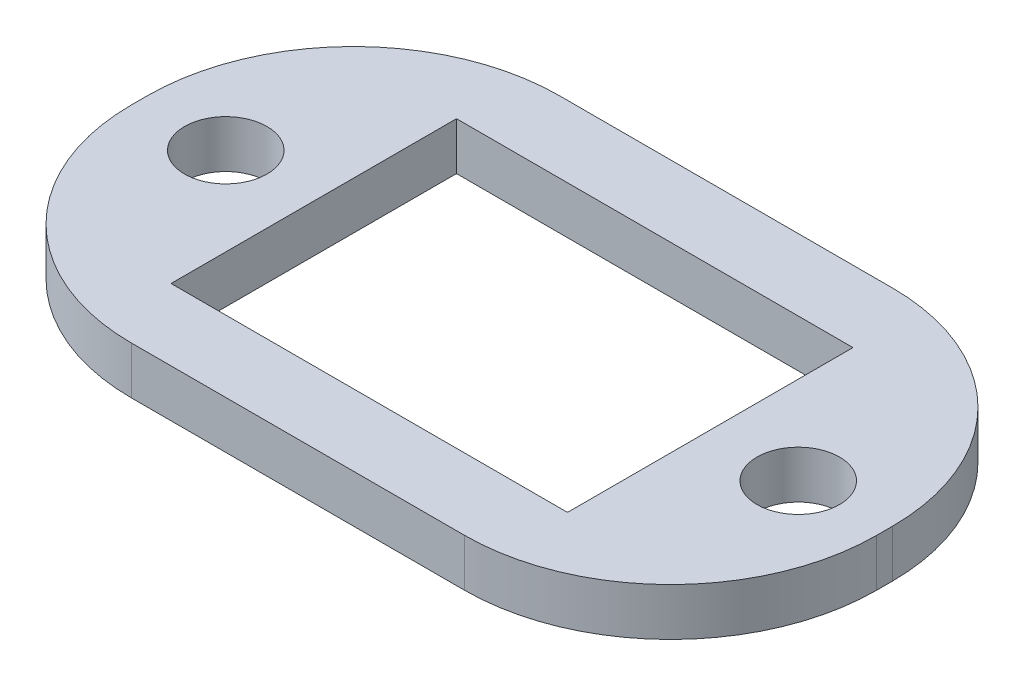
ISO-10303-21;
HEADER;
FILE_DESCRIPTION(('STEP AP214'),'2;1');
FILE_NAME('part.step','',(''),(''),'','','');
FILE_SCHEMA(('AUTOMOTIVE_DESIGN { 1 0 10303 214 1 1 1 1 }'));
ENDSEC;
DATA;
#1=APPLICATION_CONTEXT('core data for automotive mechanical design processes');
#2=APPLICATION_PROTOCOL_DEFINITION('international standard','automotive_design',2000,#1);
#3=PRODUCT_CONTEXT('',#1,'mechanical');
#4=PRODUCT('Part','Part','',(#3));
#5=PRODUCT_RELATED_PRODUCT_CATEGORY('part','',(#4));
#6=PRODUCT_DEFINITION_FORMATION('','',#4);
#7=PRODUCT_DEFINITION_CONTEXT('part definition',#1,'design');
#8=PRODUCT_DEFINITION('design','',#6,#7);
#9=PRODUCT_DEFINITION_SHAPE('','',#8);
#10=(LENGTH_UNIT() NAMED_UNIT(*) SI_UNIT(.MILLI.,.METRE.));
#11=(NAMED_UNIT(*) PLANE_ANGLE_UNIT() SI_UNIT($,.RADIAN.));
#12=(NAMED_UNIT(*) SI_UNIT($,.STERADIAN.) SOLID_ANGLE_UNIT());
#13=UNCERTAINTY_MEASURE_WITH_UNIT(LENGTH_MEASURE(1.E-05),#10,'distance_accuracy_value','');
#14=(GEOMETRIC_REPRESENTATION_CONTEXT(3) GLOBAL_UNCERTAINTY_ASSIGNED_CONTEXT((#13)) GLOBAL_UNIT_ASSIGNED_CONTEXT((#10,
#11,#12)) REPRESENTATION_CONTEXT('',''));
#15=CARTESIAN_POINT('',(0.,0.,0.));
#16=DIRECTION('',(0.,0.,1.));
#17=DIRECTION('',(1.,0.,0.));
#18=AXIS2_PLACEMENT_3D('',#15,#16,#17);
#19=CARTESIAN_POINT('',(10.5,3.,-0.5));
#20=DIRECTION('',(0.,-1.,0.));
#21=DIRECTION('',(0.,0.,-1.));
#22=AXIS2_PLACEMENT_3D('',#19,#20,#21);
#23=PLANE('',#22);
#24=CARTESIAN_POINT('',(-18.05,3.,0.));
#25=DIRECTION('',(0.,1.,0.));
#26=DIRECTION('',(0.,0.,-1.));
#27=AXIS2_PLACEMENT_3D('',#24,#25,#26);
#28=CIRCLE('',#27,2.60000000000001);
#29=CARTESIAN_POINT('',(-18.05,3.,-2.6));
#30=VERTEX_POINT('',#29);
#31=EDGE_CURVE('E177',#30,#30,#28,.T.);
#32=ORIENTED_EDGE('',*,*,#31,.F.);
#33=EDGE_LOOP('',(#32));
#34=FACE_BOUND('',#33,.T.);
#35=CARTESIAN_POINT('',(18.05,3.,0.));
#36=DIRECTION('',(0.,1.,0.));
#37=DIRECTION('',(0.,0.,1.));
#38=AXIS2_PLACEMENT_3D('',#35,#36,#37);
#39=CIRCLE('',#38,2.6);
#40=CARTESIAN_POINT('',(18.05,3.,2.6));
#41=VERTEX_POINT('',#40);
#42=EDGE_CURVE('E185',#41,#41,#39,.T.);
#43=ORIENTED_EDGE('',*,*,#42,.F.);
#44=EDGE_LOOP('',(#43));
#45=FACE_BOUND('',#44,.T.);
#46=CARTESIAN_POINT('',(10.5,3.,-0.5));
#47=DIRECTION('',(0.,1.,0.));
#48=DIRECTION('',(0.,0.,-1.));
#49=AXIS2_PLACEMENT_3D('',#46,#47,#48);
#50=CIRCLE('',#49,13.);
#51=CARTESIAN_POINT('',(23.5,3.,-0.49999999999991));
#52=VERTEX_POINT('',#51);
#53=CARTESIAN_POINT('',(10.4999999999999,3.,-13.5));
#54=VERTEX_POINT('',#53);
#55=EDGE_CURVE('E193',#52,#54,#50,.T.);
#56=ORIENTED_EDGE('',*,*,#55,.T.);
#57=DIRECTION('',(-1.,0.,0.));
#58=VECTOR('',#57,1.);
#59=CARTESIAN_POINT('',(-10.4999999999999,3.,-13.5));
#60=LINE('',#59,#58);
#61=CARTESIAN_POINT('',(-10.4999999999999,3.,-13.5));
#62=VERTEX_POINT('',#61);
#63=EDGE_CURVE('E197',#54,#62,#60,.T.);
#64=ORIENTED_EDGE('',*,*,#63,.T.);
#65=CARTESIAN_POINT('',(-10.5,3.,-0.500000000000002));
#66=DIRECTION('',(0.,1.,0.));
#67=DIRECTION('',(0.,0.,1.));
#68=AXIS2_PLACEMENT_3D('',#65,#66,#67);
#69=CIRCLE('',#68,13.);
#70=CARTESIAN_POINT('',(-23.5,3.,-0.499999999999912));
#71=VERTEX_POINT('',#70);
#72=EDGE_CURVE('E201',#62,#71,#69,.T.);
#73=ORIENTED_EDGE('',*,*,#72,.T.);
#74=DIRECTION('',(0.,0.,1.));
#75=VECTOR('',#74,1.);
#76=CARTESIAN_POINT('',(-23.5,3.,-0.499999999999909));
#77=LINE('',#76,#75);
#78=CARTESIAN_POINT('',(-23.5,3.,0.499999999999909));
#79=VERTEX_POINT('',#78);
#80=EDGE_CURVE('E204',#71,#79,#77,.T.);
#81=ORIENTED_EDGE('',*,*,#80,.T.);
#82=CARTESIAN_POINT('',(-10.5,3.,0.5));
#83=DIRECTION('',(0.,1.,0.));
#84=DIRECTION('',(0.,0.,1.));
#85=AXIS2_PLACEMENT_3D('',#82,#83,#84);
#86=CIRCLE('',#85,13.);
#87=CARTESIAN_POINT('',(-10.5,3.,13.5));
#88=VERTEX_POINT('',#87);
#89=EDGE_CURVE('E207',#79,#88,#86,.T.);
#90=ORIENTED_EDGE('',*,*,#89,.T.);
#91=DIRECTION('',(1.,0.,0.));
#92=VECTOR('',#91,1.);
#93=CARTESIAN_POINT('',(-10.4999999999999,3.,13.5));
#94=LINE('',#93,#92);
#95=CARTESIAN_POINT('',(10.4999999999999,3.,13.5));
#96=VERTEX_POINT('',#95);
#97=EDGE_CURVE('E210',#88,#96,#94,.T.);
#98=ORIENTED_EDGE('',*,*,#97,.T.);
#99=CARTESIAN_POINT('',(10.5,3.,0.500000000000002));
#100=DIRECTION('',(0.,1.,0.));
#101=DIRECTION('',(0.,0.,1.));
#102=AXIS2_PLACEMENT_3D('',#99,#100,#101);
#103=CIRCLE('',#102,13.);
#104=CARTESIAN_POINT('',(23.5,3.,0.499999999999911));
#105=VERTEX_POINT('',#104);
#106=EDGE_CURVE('E213',#96,#105,#103,.T.);
#107=ORIENTED_EDGE('',*,*,#106,.T.);
#108=DIRECTION('',(0.,0.,-1.));
#109=VECTOR('',#108,1.);
#110=CARTESIAN_POINT('',(23.5,3.,-0.49999999999991));
#111=LINE('',#110,#109);
#112=EDGE_CURVE('E216',#105,#52,#111,.T.);
#113=ORIENTED_EDGE('',*,*,#112,.T.);
#114=EDGE_LOOP('',(#56,#64,#73,#81,#90,#98,#107,#113));
#115=FACE_BOUND('',#114,.T.);
#116=DIRECTION('',(0.,0.,-1.));
#117=VECTOR('',#116,1.);
#118=CARTESIAN_POINT('',(12.5,3.,-9.));
#119=LINE('',#118,#117);
#120=CARTESIAN_POINT('',(12.5,3.,9.));
#121=VERTEX_POINT('',#120);
#122=CARTESIAN_POINT('',(12.5,3.,-9.));
#123=VERTEX_POINT('',#122);
#124=EDGE_CURVE('E129',#121,#123,#119,.T.);
#125=ORIENTED_EDGE('',*,*,#124,.F.);
#126=DIRECTION('',(1.,0.,0.));
#127=VECTOR('',#126,1.);
#128=CARTESIAN_POINT('',(-12.5,3.,9.));
#129=LINE('',#128,#127);
#130=CARTESIAN_POINT('',(-12.5,3.,9.));
#131=VERTEX_POINT('',#130);
#132=EDGE_CURVE('E155',#131,#121,#129,.T.);
#133=ORIENTED_EDGE('',*,*,#132,.F.);
#134=DIRECTION('',(0.,0.,1.));
#135=VECTOR('',#134,1.);
#136=CARTESIAN_POINT('',(-12.5,3.,-9.));
#137=LINE('',#136,#135);
#138=CARTESIAN_POINT('',(-12.5,3.,-9.));
#139=VERTEX_POINT('',#138);
#140=EDGE_CURVE('E151',#139,#131,#137,.T.);
#141=ORIENTED_EDGE('',*,*,#140,.F.);
#142=DIRECTION('',(-1.,0.,0.));
#143=VECTOR('',#142,1.);
#144=CARTESIAN_POINT('',(-12.5,3.,-9.));
#145=LINE('',#144,#143);
#146=EDGE_CURVE('E138',#123,#139,#145,.T.);
#147=ORIENTED_EDGE('',*,*,#146,.F.);
#148=EDGE_LOOP('',(#125,#133,#141,#147));
#149=FACE_BOUND('',#148,.T.);
#150=ADVANCED_FACE('F39',(#34,#45,#115,#149),#23,.F.);
#151=CARTESIAN_POINT('',(10.5,0.,-0.5));
#152=DIRECTION('',(0.,-1.,0.));
#153=DIRECTION('',(0.,0.,-1.));
#154=AXIS2_PLACEMENT_3D('',#151,#152,#153);
#155=PLANE('',#154);
#156=CARTESIAN_POINT('',(18.05,0.,0.));
#157=DIRECTION('',(0.,1.,0.));
#158=DIRECTION('',(0.,0.,1.));
#159=AXIS2_PLACEMENT_3D('',#156,#157,#158);
#160=CIRCLE('',#159,2.6);
#161=CARTESIAN_POINT('',(18.05,0.,2.6));
#162=VERTEX_POINT('',#161);
#163=EDGE_CURVE('E181',#162,#162,#160,.T.);
#164=ORIENTED_EDGE('',*,*,#163,.T.);
#165=EDGE_LOOP('',(#164));
#166=FACE_BOUND('',#165,.T.);
#167=CARTESIAN_POINT('',(10.5,0.,-0.5));
#168=DIRECTION('',(0.,1.,0.));
#169=DIRECTION('',(0.,0.,-1.));
#170=AXIS2_PLACEMENT_3D('',#167,#168,#169);
#171=CIRCLE('',#170,13.);
#172=CARTESIAN_POINT('',(23.5,0.,-0.49999999999991));
#173=VERTEX_POINT('',#172);
#174=CARTESIAN_POINT('',(10.4999999999999,0.,-13.5));
#175=VERTEX_POINT('',#174);
#176=EDGE_CURVE('E189',#173,#175,#171,.T.);
#177=ORIENTED_EDGE('',*,*,#176,.F.);
#178=DIRECTION('',(0.,0.,-1.));
#179=VECTOR('',#178,1.);
#180=CARTESIAN_POINT('',(23.5,0.,-0.49999999999991));
#181=LINE('',#180,#179);
#182=CARTESIAN_POINT('',(23.5,0.,0.499999999999911));
#183=VERTEX_POINT('',#182);
#184=EDGE_CURVE('E198',#183,#173,#181,.T.);
#185=ORIENTED_EDGE('',*,*,#184,.F.);
#186=CARTESIAN_POINT('',(10.5,0.,0.500000000000002));
#187=DIRECTION('',(0.,1.,0.));
#188=DIRECTION('',(0.,0.,1.));
#189=AXIS2_PLACEMENT_3D('',#186,#187,#188);
#190=CIRCLE('',#189,13.);
#191=CARTESIAN_POINT('',(10.4999999999999,0.,13.5));
#192=VERTEX_POINT('',#191);
#193=EDGE_CURVE('E238',#192,#183,#190,.T.);
#194=ORIENTED_EDGE('',*,*,#193,.F.);
#195=DIRECTION('',(1.,0.,0.));
#196=VECTOR('',#195,1.);
#197=CARTESIAN_POINT('',(-10.4999999999999,0.,13.5));
#198=LINE('',#197,#196);
#199=CARTESIAN_POINT('',(-10.5,0.,13.5));
#200=VERTEX_POINT('',#199);
#201=EDGE_CURVE('E235',#200,#192,#198,.T.);
#202=ORIENTED_EDGE('',*,*,#201,.F.);
#203=CARTESIAN_POINT('',(-10.5,0.,0.5));
#204=DIRECTION('',(0.,1.,0.));
#205=DIRECTION('',(0.,0.,1.));
#206=AXIS2_PLACEMENT_3D('',#203,#204,#205);
#207=CIRCLE('',#206,13.);
#208=CARTESIAN_POINT('',(-23.5,0.,0.499999999999909));
#209=VERTEX_POINT('',#208);
#210=EDGE_CURVE('E232',#209,#200,#207,.T.);
#211=ORIENTED_EDGE('',*,*,#210,.F.);
#212=DIRECTION('',(0.,0.,1.));
#213=VECTOR('',#212,1.);
#214=CARTESIAN_POINT('',(-23.5,0.,-0.499999999999909));
#215=LINE('',#214,#213);
#216=CARTESIAN_POINT('',(-23.5,0.,-0.499999999999912));
#217=VERTEX_POINT('',#216);
#218=EDGE_CURVE('E229',#217,#209,#215,.T.);
#219=ORIENTED_EDGE('',*,*,#218,.F.);
#220=CARTESIAN_POINT('',(-10.5,0.,-0.500000000000002));
#221=DIRECTION('',(0.,1.,0.));
#222=DIRECTION('',(0.,0.,1.));
#223=AXIS2_PLACEMENT_3D('',#220,#221,#222);
#224=CIRCLE('',#223,13.);
#225=CARTESIAN_POINT('',(-10.4999999999999,0.,-13.5));
#226=VERTEX_POINT('',#225);
#227=EDGE_CURVE('E226',#226,#217,#224,.T.);
#228=ORIENTED_EDGE('',*,*,#227,.F.);
#229=DIRECTION('',(-1.,0.,0.));
#230=VECTOR('',#229,1.);
#231=CARTESIAN_POINT('',(-10.4999999999999,0.,-13.5));
#232=LINE('',#231,#230);
#233=EDGE_CURVE('E223',#175,#226,#232,.T.);
#234=ORIENTED_EDGE('',*,*,#233,.F.);
#235=EDGE_LOOP('',(#177,#185,#194,#202,#211,#219,#228,#234));
#236=FACE_BOUND('',#235,.T.);
#237=CARTESIAN_POINT('',(-18.05,0.,0.));
#238=DIRECTION('',(0.,1.,0.));
#239=DIRECTION('',(0.,0.,-1.));
#240=AXIS2_PLACEMENT_3D('',#237,#238,#239);
#241=CIRCLE('',#240,2.60000000000001);
#242=CARTESIAN_POINT('',(-18.05,0.,-2.6));
#243=VERTEX_POINT('',#242);
#244=EDGE_CURVE('E147',#243,#243,#241,.T.);
#245=ORIENTED_EDGE('',*,*,#244,.T.);
#246=EDGE_LOOP('',(#245));
#247=FACE_BOUND('',#246,.T.);
#248=DIRECTION('',(1.,0.,0.));
#249=VECTOR('',#248,1.);
#250=CARTESIAN_POINT('',(-12.5,0.,9.));
#251=LINE('',#250,#249);
#252=CARTESIAN_POINT('',(-12.5,0.,9.));
#253=VERTEX_POINT('',#252);
#254=CARTESIAN_POINT('',(12.5,0.,9.));
#255=VERTEX_POINT('',#254);
#256=EDGE_CURVE('E139',#253,#255,#251,.T.);
#257=ORIENTED_EDGE('',*,*,#256,.T.);
#258=DIRECTION('',(0.,0.,-1.));
#259=VECTOR('',#258,1.);
#260=CARTESIAN_POINT('',(12.5,0.,-9.));
#261=LINE('',#260,#259);
#262=CARTESIAN_POINT('',(12.5,0.,-9.));
#263=VERTEX_POINT('',#262);
#264=EDGE_CURVE('E63',#255,#263,#261,.T.);
#265=ORIENTED_EDGE('',*,*,#264,.T.);
#266=DIRECTION('',(-1.,0.,0.));
#267=VECTOR('',#266,1.);
#268=CARTESIAN_POINT('',(-12.5,0.,-9.));
#269=LINE('',#268,#267);
#270=CARTESIAN_POINT('',(-12.5,0.,-9.));
#271=VERTEX_POINT('',#270);
#272=EDGE_CURVE('E145',#263,#271,#269,.T.);
#273=ORIENTED_EDGE('',*,*,#272,.T.);
#274=DIRECTION('',(0.,0.,1.));
#275=VECTOR('',#274,1.);
#276=CARTESIAN_POINT('',(-12.5,0.,-9.));
#277=LINE('',#276,#275);
#278=EDGE_CURVE('E164',#271,#253,#277,.T.);
#279=ORIENTED_EDGE('',*,*,#278,.T.);
#280=EDGE_LOOP('',(#257,#265,#273,#279));
#281=FACE_BOUND('',#280,.T.);
#282=ADVANCED_FACE('F277',(#166,#236,#247,#281),#155,.T.);
#283=CARTESIAN_POINT('',(10.5,3.,-0.5));
#284=DIRECTION('',(0.,-1.,0.));
#285=DIRECTION('',(0.,0.,-1.));
#286=AXIS2_PLACEMENT_3D('',#283,#284,#285);
#287=CYLINDRICAL_SURFACE('',#286,13.);
#288=ORIENTED_EDGE('',*,*,#176,.T.);
#289=DIRECTION('',(0.,-1.,0.));
#290=VECTOR('',#289,1.);
#291=CARTESIAN_POINT('',(10.4999999999999,3.,-13.5));
#292=LINE('',#291,#290);
#293=EDGE_CURVE('E11',#54,#175,#292,.T.);
#294=ORIENTED_EDGE('',*,*,#293,.F.);
#295=ORIENTED_EDGE('',*,*,#55,.F.);
#296=DIRECTION('',(0.,-1.,0.));
#297=VECTOR('',#296,1.);
#298=CARTESIAN_POINT('',(23.5,3.,-0.49999999999991));
#299=LINE('',#298,#297);
#300=EDGE_CURVE('E219',#52,#173,#299,.T.);
#301=ORIENTED_EDGE('',*,*,#300,.T.);
#302=EDGE_LOOP('',(#288,#294,#295,#301));
#303=FACE_BOUND('',#302,.T.);
#304=ADVANCED_FACE('F41',(#303),#287,.T.);
#305=CARTESIAN_POINT('',(-10.4999999999999,3.,-13.5));
#306=DIRECTION('',(0.,0.,1.));
#307=DIRECTION('',(1.,0.,0.));
#308=AXIS2_PLACEMENT_3D('',#305,#306,#307);
#309=PLANE('',#308);
#310=ORIENTED_EDGE('',*,*,#233,.T.);
#311=DIRECTION('',(0.,-1.,0.));
#312=VECTOR('',#311,1.);
#313=CARTESIAN_POINT('',(-10.4999999999999,3.,-13.5));
#314=LINE('',#313,#312);
#315=EDGE_CURVE('E48',#62,#226,#314,.T.);
#316=ORIENTED_EDGE('',*,*,#315,.F.);
#317=ORIENTED_EDGE('',*,*,#63,.F.);
#318=ORIENTED_EDGE('',*,*,#293,.T.);
#319=EDGE_LOOP('',(#310,#316,#317,#318));
#320=FACE_BOUND('',#319,.T.);
#321=ADVANCED_FACE('F294',(#320),#309,.F.);
#322=CARTESIAN_POINT('',(-10.5,3.,-0.500000000000002));
#323=DIRECTION('',(0.,-1.,0.));
#324=DIRECTION('',(0.,0.,-1.));
#325=AXIS2_PLACEMENT_3D('',#322,#323,#324);
#326=CYLINDRICAL_SURFACE('',#325,13.);
#327=ORIENTED_EDGE('',*,*,#227,.T.);
#328=DIRECTION('',(0.,-1.,0.));
#329=VECTOR('',#328,1.);
#330=CARTESIAN_POINT('',(-23.5,3.,-0.499999999999912));
#331=LINE('',#330,#329);
#332=EDGE_CURVE('E262',#71,#217,#331,.T.);
#333=ORIENTED_EDGE('',*,*,#332,.F.);
#334=ORIENTED_EDGE('',*,*,#72,.F.);
#335=ORIENTED_EDGE('',*,*,#315,.T.);
#336=EDGE_LOOP('',(#327,#333,#334,#335));
#337=FACE_BOUND('',#336,.T.);
#338=ADVANCED_FACE('F271',(#337),#326,.T.);
#339=CARTESIAN_POINT('',(-23.5,3.,-0.499999999999909));
#340=DIRECTION('',(1.,0.,0.));
#341=DIRECTION('',(0.,0.,-1.));
#342=AXIS2_PLACEMENT_3D('',#339,#340,#341);
#343=PLANE('',#342);
#344=ORIENTED_EDGE('',*,*,#218,.T.);
#345=DIRECTION('',(0.,-1.,0.));
#346=VECTOR('',#345,1.);
#347=CARTESIAN_POINT('',(-23.5,3.,0.499999999999909));
#348=LINE('',#347,#346);
#349=EDGE_CURVE('E258',#79,#209,#348,.T.);
#350=ORIENTED_EDGE('',*,*,#349,.F.);
#351=ORIENTED_EDGE('',*,*,#80,.F.);
#352=ORIENTED_EDGE('',*,*,#332,.T.);
#353=EDGE_LOOP('',(#344,#350,#351,#352));
#354=FACE_BOUND('',#353,.T.);
#355=ADVANCED_FACE('F283',(#354),#343,.F.);
#356=CARTESIAN_POINT('',(-10.5,3.,0.5));
#357=DIRECTION('',(0.,-1.,0.));
#358=DIRECTION('',(0.,0.,-1.));
#359=AXIS2_PLACEMENT_3D('',#356,#357,#358);
#360=CYLINDRICAL_SURFACE('',#359,13.);
#361=ORIENTED_EDGE('',*,*,#210,.T.);
#362=DIRECTION('',(0.,-1.,0.));
#363=VECTOR('',#362,1.);
#364=CARTESIAN_POINT('',(-10.5,3.,13.5));
#365=LINE('',#364,#363);
#366=EDGE_CURVE('E254',#88,#200,#365,.T.);
#367=ORIENTED_EDGE('',*,*,#366,.F.);
#368=ORIENTED_EDGE('',*,*,#89,.F.);
#369=ORIENTED_EDGE('',*,*,#349,.T.);
#370=EDGE_LOOP('',(#361,#367,#368,#369));
#371=FACE_BOUND('',#370,.T.);
#372=ADVANCED_FACE('F287',(#371),#360,.T.);
#373=CARTESIAN_POINT('',(-10.4999999999999,3.,13.5));
#374=DIRECTION('',(0.,0.,-1.));
#375=DIRECTION('',(-1.,0.,0.));
#376=AXIS2_PLACEMENT_3D('',#373,#374,#375);
#377=PLANE('',#376);
#378=ORIENTED_EDGE('',*,*,#201,.T.);
#379=DIRECTION('',(0.,-1.,0.));
#380=VECTOR('',#379,1.);
#381=CARTESIAN_POINT('',(10.4999999999999,3.,13.5));
#382=LINE('',#381,#380);
#383=EDGE_CURVE('E250',#96,#192,#382,.T.);
#384=ORIENTED_EDGE('',*,*,#383,.F.);
#385=ORIENTED_EDGE('',*,*,#97,.F.);
#386=ORIENTED_EDGE('',*,*,#366,.T.);
#387=EDGE_LOOP('',(#378,#384,#385,#386));
#388=FACE_BOUND('',#387,.T.);
#389=ADVANCED_FACE('F307',(#388),#377,.F.);
#390=CARTESIAN_POINT('',(10.5,3.,0.500000000000002));
#391=DIRECTION('',(0.,-1.,0.));
#392=DIRECTION('',(0.,0.,-1.));
#393=AXIS2_PLACEMENT_3D('',#390,#391,#392);
#394=CYLINDRICAL_SURFACE('',#393,13.);
#395=ORIENTED_EDGE('',*,*,#193,.T.);
#396=DIRECTION('',(0.,-1.,0.));
#397=VECTOR('',#396,1.);
#398=CARTESIAN_POINT('',(23.5,3.,0.499999999999911));
#399=LINE('',#398,#397);
#400=EDGE_CURVE('E246',#105,#183,#399,.T.);
#401=ORIENTED_EDGE('',*,*,#400,.F.);
#402=ORIENTED_EDGE('',*,*,#106,.F.);
#403=ORIENTED_EDGE('',*,*,#383,.T.);
#404=EDGE_LOOP('',(#395,#401,#402,#403));
#405=FACE_BOUND('',#404,.T.);
#406=ADVANCED_FACE('F305',(#405),#394,.T.);
#407=CARTESIAN_POINT('',(23.5,3.,-0.49999999999991));
#408=DIRECTION('',(-1.,0.,0.));
#409=DIRECTION('',(0.,0.,1.));
#410=AXIS2_PLACEMENT_3D('',#407,#408,#409);
#411=PLANE('',#410);
#412=ORIENTED_EDGE('',*,*,#184,.T.);
#413=ORIENTED_EDGE('',*,*,#300,.F.);
#414=ORIENTED_EDGE('',*,*,#112,.F.);
#415=ORIENTED_EDGE('',*,*,#400,.T.);
#416=EDGE_LOOP('',(#412,#413,#414,#415));
#417=FACE_BOUND('',#416,.T.);
#418=ADVANCED_FACE('F300',(#417),#411,.F.);
#419=CARTESIAN_POINT('',(18.05,3.,0.));
#420=DIRECTION('',(0.,-1.,0.));
#421=DIRECTION('',(0.,0.,-1.));
#422=AXIS2_PLACEMENT_3D('',#419,#420,#421);
#423=CYLINDRICAL_SURFACE('',#422,2.6);
#424=ORIENTED_EDGE('',*,*,#42,.T.);
#425=EDGE_LOOP('',(#424));
#426=FACE_BOUND('',#425,.T.);
#427=ORIENTED_EDGE('',*,*,#163,.F.);
#428=EDGE_LOOP('',(#427));
#429=FACE_BOUND('',#428,.T.);
#430=ADVANCED_FACE('F327',(#426,#429),#423,.F.);
#431=CARTESIAN_POINT('',(-18.05,3.,0.));
#432=DIRECTION('',(0.,-1.,0.));
#433=DIRECTION('',(0.,0.,-1.));
#434=AXIS2_PLACEMENT_3D('',#431,#432,#433);
#435=CYLINDRICAL_SURFACE('',#434,2.60000000000001);
#436=ORIENTED_EDGE('',*,*,#31,.T.);
#437=EDGE_LOOP('',(#436));
#438=FACE_BOUND('',#437,.T.);
#439=ORIENTED_EDGE('',*,*,#244,.F.);
#440=EDGE_LOOP('',(#439));
#441=FACE_BOUND('',#440,.T.);
#442=ADVANCED_FACE('F334',(#438,#441),#435,.F.);
#443=CARTESIAN_POINT('',(12.5,3.,-9.));
#444=DIRECTION('',(-1.,0.,0.));
#445=DIRECTION('',(0.,0.,1.));
#446=AXIS2_PLACEMENT_3D('',#443,#444,#445);
#447=PLANE('',#446);
#448=ORIENTED_EDGE('',*,*,#264,.F.);
#449=DIRECTION('',(0.,-1.,0.));
#450=VECTOR('',#449,1.);
#451=CARTESIAN_POINT('',(12.5,3.,9.));
#452=LINE('',#451,#450);
#453=EDGE_CURVE('E133',#121,#255,#452,.T.);
#454=ORIENTED_EDGE('',*,*,#453,.F.);
#455=ORIENTED_EDGE('',*,*,#124,.T.);
#456=DIRECTION('',(0.,-1.,0.));
#457=VECTOR('',#456,1.);
#458=CARTESIAN_POINT('',(12.5,3.,-9.));
#459=LINE('',#458,#457);
#460=EDGE_CURVE('E132',#123,#263,#459,.T.);
#461=ORIENTED_EDGE('',*,*,#460,.T.);
#462=EDGE_LOOP('',(#448,#454,#455,#461));
#463=FACE_BOUND('',#462,.T.);
#464=ADVANCED_FACE('F131',(#463),#447,.T.);
#465=CARTESIAN_POINT('',(-12.5,3.,-9.));
#466=DIRECTION('',(0.,0.,1.));
#467=DIRECTION('',(1.,0.,0.));
#468=AXIS2_PLACEMENT_3D('',#465,#466,#467);
#469=PLANE('',#468);
#470=ORIENTED_EDGE('',*,*,#272,.F.);
#471=ORIENTED_EDGE('',*,*,#460,.F.);
#472=ORIENTED_EDGE('',*,*,#146,.T.);
#473=DIRECTION('',(0.,-1.,0.));
#474=VECTOR('',#473,1.);
#475=CARTESIAN_POINT('',(-12.5,3.,-9.));
#476=LINE('',#475,#474);
#477=EDGE_CURVE('E148',#139,#271,#476,.T.);
#478=ORIENTED_EDGE('',*,*,#477,.T.);
#479=EDGE_LOOP('',(#470,#471,#472,#478));
#480=FACE_BOUND('',#479,.T.);
#481=ADVANCED_FACE('F142',(#480),#469,.T.);
#482=CARTESIAN_POINT('',(-12.5,3.,-9.));
#483=DIRECTION('',(1.,0.,0.));
#484=DIRECTION('',(0.,0.,-1.));
#485=AXIS2_PLACEMENT_3D('',#482,#483,#484);
#486=PLANE('',#485);
#487=ORIENTED_EDGE('',*,*,#278,.F.);
#488=ORIENTED_EDGE('',*,*,#477,.F.);
#489=ORIENTED_EDGE('',*,*,#140,.T.);
#490=DIRECTION('',(0.,-1.,0.));
#491=VECTOR('',#490,1.);
#492=CARTESIAN_POINT('',(-12.5,3.,9.));
#493=LINE('',#492,#491);
#494=EDGE_CURVE('E55',#131,#253,#493,.T.);
#495=ORIENTED_EDGE('',*,*,#494,.T.);
#496=EDGE_LOOP('',(#487,#488,#489,#495));
#497=FACE_BOUND('',#496,.T.);
#498=ADVANCED_FACE('F351',(#497),#486,.T.);
#499=CARTESIAN_POINT('',(-12.5,3.,9.));
#500=DIRECTION('',(0.,0.,-1.));
#501=DIRECTION('',(-1.,0.,0.));
#502=AXIS2_PLACEMENT_3D('',#499,#500,#501);
#503=PLANE('',#502);
#504=ORIENTED_EDGE('',*,*,#256,.F.);
#505=ORIENTED_EDGE('',*,*,#494,.F.);
#506=ORIENTED_EDGE('',*,*,#132,.T.);
#507=ORIENTED_EDGE('',*,*,#453,.T.);
#508=EDGE_LOOP('',(#504,#505,#506,#507));
#509=FACE_BOUND('',#508,.T.);
#510=ADVANCED_FACE('F354',(#509),#503,.T.);
#511=CLOSED_SHELL('',(#150,#282,#304,#321,#338,#355,#372,#389,#406,#418,#430,#442,#464,#481,
#498,#510));
#512=MANIFOLD_SOLID_BREP('B2',#511);
#513=ADVANCED_BREP_SHAPE_REPRESENTATION('',(#18,#512),#14);
#514=SHAPE_DEFINITION_REPRESENTATION(#9,#513);
ENDSEC;
END-ISO-10303-21;
